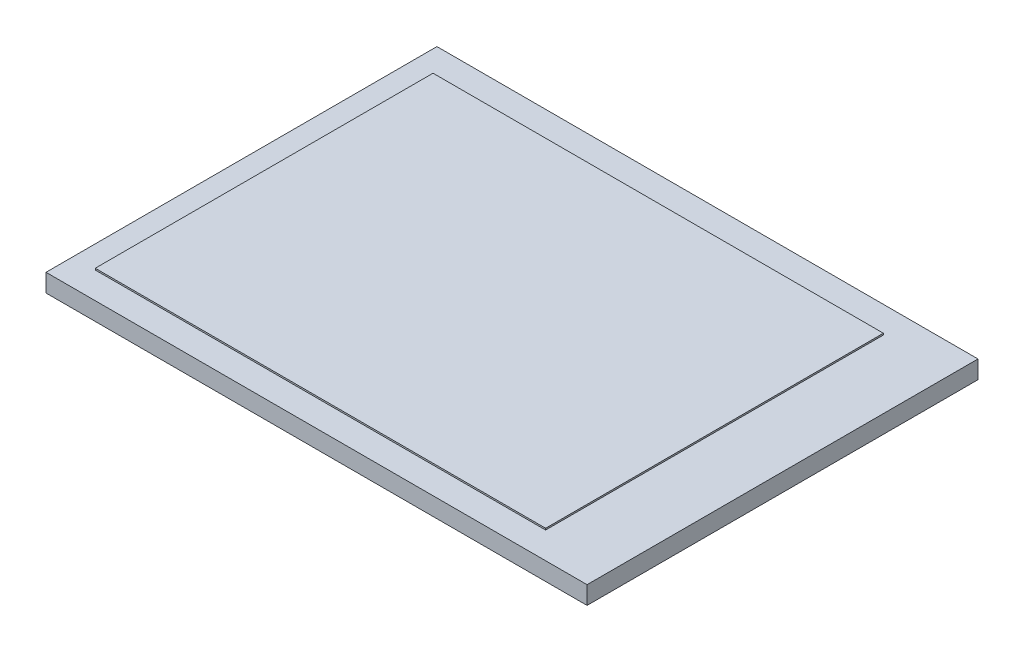
ISO-10303-21;
HEADER;
FILE_DESCRIPTION(('STEP AP214'),'2;1');
FILE_NAME('part.step','',(''),(''),'','','');
FILE_SCHEMA(('AUTOMOTIVE_DESIGN { 1 0 10303 214 1 1 1 1 }'));
ENDSEC;
DATA;
#1=APPLICATION_CONTEXT('core data for automotive mechanical design processes');
#2=APPLICATION_PROTOCOL_DEFINITION('international standard','automotive_design',2000,#1);
#3=PRODUCT_CONTEXT('',#1,'mechanical');
#4=PRODUCT('Part','Part','',(#3));
#5=PRODUCT_RELATED_PRODUCT_CATEGORY('part','',(#4));
#6=PRODUCT_DEFINITION_FORMATION('','',#4);
#7=PRODUCT_DEFINITION_CONTEXT('part definition',#1,'design');
#8=PRODUCT_DEFINITION('design','',#6,#7);
#9=PRODUCT_DEFINITION_SHAPE('','',#8);
#10=(LENGTH_UNIT() NAMED_UNIT(*) SI_UNIT(.MILLI.,.METRE.));
#11=(NAMED_UNIT(*) PLANE_ANGLE_UNIT() SI_UNIT($,.RADIAN.));
#12=(NAMED_UNIT(*) SI_UNIT($,.STERADIAN.) SOLID_ANGLE_UNIT());
#13=UNCERTAINTY_MEASURE_WITH_UNIT(LENGTH_MEASURE(1.E-05),#10,'distance_accuracy_value','');
#14=(GEOMETRIC_REPRESENTATION_CONTEXT(3) GLOBAL_UNCERTAINTY_ASSIGNED_CONTEXT((#13)) GLOBAL_UNIT_ASSIGNED_CONTEXT((#10,
#11,#12)) REPRESENTATION_CONTEXT('',''));
#15=CARTESIAN_POINT('',(0.,0.,0.));
#16=DIRECTION('',(0.,0.,1.));
#17=DIRECTION('',(1.,0.,0.));
#18=AXIS2_PLACEMENT_3D('',#15,#16,#17);
#19=CARTESIAN_POINT('',(0.,2.3,0.));
#20=DIRECTION('',(0.,-1.,0.));
#21=DIRECTION('',(0.,0.,-1.));
#22=AXIS2_PLACEMENT_3D('',#19,#20,#21);
#23=PLANE('',#22);
#24=DIRECTION('',(0.,0.,-1.));
#25=VECTOR('',#24,1.);
#26=CARTESIAN_POINT('',(34.6,2.3,25.));
#27=LINE('',#26,#25);
#28=CARTESIAN_POINT('',(34.6,2.3,25.));
#29=VERTEX_POINT('',#28);
#30=CARTESIAN_POINT('',(34.6,2.3,-25.));
#31=VERTEX_POINT('',#30);
#32=EDGE_CURVE('E128',#29,#31,#27,.T.);
#33=ORIENTED_EDGE('',*,*,#32,.T.);
#34=DIRECTION('',(-1.,0.,0.));
#35=VECTOR('',#34,1.);
#36=CARTESIAN_POINT('',(-34.6,2.3,-25.));
#37=LINE('',#36,#35);
#38=CARTESIAN_POINT('',(-34.6,2.3,-25.));
#39=VERTEX_POINT('',#38);
#40=EDGE_CURVE('E131',#31,#39,#37,.T.);
#41=ORIENTED_EDGE('',*,*,#40,.T.);
#42=DIRECTION('',(0.,0.,1.));
#43=VECTOR('',#42,1.);
#44=CARTESIAN_POINT('',(-34.6,2.3,25.));
#45=LINE('',#44,#43);
#46=CARTESIAN_POINT('',(-34.6,2.3,25.));
#47=VERTEX_POINT('',#46);
#48=EDGE_CURVE('E134',#39,#47,#45,.T.);
#49=ORIENTED_EDGE('',*,*,#48,.T.);
#50=DIRECTION('',(1.,0.,0.));
#51=VECTOR('',#50,1.);
#52=CARTESIAN_POINT('',(-34.6,2.3,25.));
#53=LINE('',#52,#51);
#54=EDGE_CURVE('E136',#47,#29,#53,.T.);
#55=ORIENTED_EDGE('',*,*,#54,.T.);
#56=EDGE_LOOP('',(#33,#41,#49,#55));
#57=FACE_BOUND('',#56,.T.);
#58=DIRECTION('',(0.,0.,1.));
#59=VECTOR('',#58,1.);
#60=CARTESIAN_POINT('',(-31.7,2.3,21.6));
#61=LINE('',#60,#59);
#62=CARTESIAN_POINT('',(-31.7,2.3,-21.6));
#63=VERTEX_POINT('',#62);
#64=CARTESIAN_POINT('',(-31.7,2.3,21.6));
#65=VERTEX_POINT('',#64);
#66=EDGE_CURVE('E49',#63,#65,#61,.T.);
#67=ORIENTED_EDGE('',*,*,#66,.F.);
#68=DIRECTION('',(-1.,0.,0.));
#69=VECTOR('',#68,1.);
#70=CARTESIAN_POINT('',(25.9,2.3,-21.6));
#71=LINE('',#70,#69);
#72=CARTESIAN_POINT('',(25.9,2.3,-21.6));
#73=VERTEX_POINT('',#72);
#74=EDGE_CURVE('E53',#73,#63,#71,.T.);
#75=ORIENTED_EDGE('',*,*,#74,.F.);
#76=DIRECTION('',(0.,0.,-1.));
#77=VECTOR('',#76,1.);
#78=CARTESIAN_POINT('',(25.9,2.3,21.6));
#79=LINE('',#78,#77);
#80=CARTESIAN_POINT('',(25.9,2.3,21.6));
#81=VERTEX_POINT('',#80);
#82=EDGE_CURVE('E243',#81,#73,#79,.T.);
#83=ORIENTED_EDGE('',*,*,#82,.F.);
#84=DIRECTION('',(1.,0.,0.));
#85=VECTOR('',#84,1.);
#86=CARTESIAN_POINT('',(25.9,2.3,21.6));
#87=LINE('',#86,#85);
#88=EDGE_CURVE('E249',#65,#81,#87,.T.);
#89=ORIENTED_EDGE('',*,*,#88,.F.);
#90=EDGE_LOOP('',(#67,#75,#83,#89));
#91=FACE_BOUND('',#90,.T.);
#92=ADVANCED_FACE('F34',(#57,#91),#23,.F.);
#93=CARTESIAN_POINT('',(34.6,2.3,25.));
#94=DIRECTION('',(-1.,0.,0.));
#95=DIRECTION('',(0.,0.,1.));
#96=AXIS2_PLACEMENT_3D('',#93,#94,#95);
#97=PLANE('',#96);
#98=DIRECTION('',(0.,0.,-1.));
#99=VECTOR('',#98,1.);
#100=CARTESIAN_POINT('',(34.6,0.,25.));
#101=LINE('',#100,#99);
#102=CARTESIAN_POINT('',(34.6,0.,25.));
#103=VERTEX_POINT('',#102);
#104=CARTESIAN_POINT('',(34.6,0.,-25.));
#105=VERTEX_POINT('',#104);
#106=EDGE_CURVE('E119',#103,#105,#101,.T.);
#107=ORIENTED_EDGE('',*,*,#106,.T.);
#108=DIRECTION('',(0.,-1.,0.));
#109=VECTOR('',#108,1.);
#110=CARTESIAN_POINT('',(34.6,2.3,-25.));
#111=LINE('',#110,#109);
#112=EDGE_CURVE('E11',#31,#105,#111,.T.);
#113=ORIENTED_EDGE('',*,*,#112,.F.);
#114=ORIENTED_EDGE('',*,*,#32,.F.);
#115=DIRECTION('',(0.,-1.,0.));
#116=VECTOR('',#115,1.);
#117=CARTESIAN_POINT('',(34.6,2.3,25.));
#118=LINE('',#117,#116);
#119=EDGE_CURVE('E137',#29,#103,#118,.T.);
#120=ORIENTED_EDGE('',*,*,#119,.T.);
#121=EDGE_LOOP('',(#107,#113,#114,#120));
#122=FACE_BOUND('',#121,.T.);
#123=ADVANCED_FACE('F36',(#122),#97,.F.);
#124=CARTESIAN_POINT('',(-34.6,2.3,-25.));
#125=DIRECTION('',(0.,0.,1.));
#126=DIRECTION('',(1.,0.,0.));
#127=AXIS2_PLACEMENT_3D('',#124,#125,#126);
#128=PLANE('',#127);
#129=DIRECTION('',(-1.,0.,0.));
#130=VECTOR('',#129,1.);
#131=CARTESIAN_POINT('',(-34.6,0.,-25.));
#132=LINE('',#131,#130);
#133=CARTESIAN_POINT('',(-34.6,0.,-25.));
#134=VERTEX_POINT('',#133);
#135=EDGE_CURVE('E122',#105,#134,#132,.T.);
#136=ORIENTED_EDGE('',*,*,#135,.T.);
#137=DIRECTION('',(0.,-1.,0.));
#138=VECTOR('',#137,1.);
#139=CARTESIAN_POINT('',(-34.6,2.3,-25.));
#140=LINE('',#139,#138);
#141=EDGE_CURVE('E42',#39,#134,#140,.T.);
#142=ORIENTED_EDGE('',*,*,#141,.F.);
#143=ORIENTED_EDGE('',*,*,#40,.F.);
#144=ORIENTED_EDGE('',*,*,#112,.T.);
#145=EDGE_LOOP('',(#136,#142,#143,#144));
#146=FACE_BOUND('',#145,.T.);
#147=ADVANCED_FACE('F167',(#146),#128,.F.);
#148=CARTESIAN_POINT('',(-34.6,2.3,25.));
#149=DIRECTION('',(1.,0.,0.));
#150=DIRECTION('',(0.,0.,-1.));
#151=AXIS2_PLACEMENT_3D('',#148,#149,#150);
#152=PLANE('',#151);
#153=DIRECTION('',(0.,0.,1.));
#154=VECTOR('',#153,1.);
#155=CARTESIAN_POINT('',(-34.6,0.,25.));
#156=LINE('',#155,#154);
#157=CARTESIAN_POINT('',(-34.6,0.,25.));
#158=VERTEX_POINT('',#157);
#159=EDGE_CURVE('E140',#134,#158,#156,.T.);
#160=ORIENTED_EDGE('',*,*,#159,.T.);
#161=DIRECTION('',(0.,-1.,0.));
#162=VECTOR('',#161,1.);
#163=CARTESIAN_POINT('',(-34.6,2.3,25.));
#164=LINE('',#163,#162);
#165=EDGE_CURVE('E145',#47,#158,#164,.T.);
#166=ORIENTED_EDGE('',*,*,#165,.F.);
#167=ORIENTED_EDGE('',*,*,#48,.F.);
#168=ORIENTED_EDGE('',*,*,#141,.T.);
#169=EDGE_LOOP('',(#160,#166,#167,#168));
#170=FACE_BOUND('',#169,.T.);
#171=ADVANCED_FACE('F152',(#170),#152,.F.);
#172=CARTESIAN_POINT('',(-34.6,2.3,25.));
#173=DIRECTION('',(0.,0.,-1.));
#174=DIRECTION('',(-1.,0.,0.));
#175=AXIS2_PLACEMENT_3D('',#172,#173,#174);
#176=PLANE('',#175);
#177=DIRECTION('',(1.,0.,0.));
#178=VECTOR('',#177,1.);
#179=CARTESIAN_POINT('',(-34.6,0.,25.));
#180=LINE('',#179,#178);
#181=EDGE_CURVE('E132',#158,#103,#180,.T.);
#182=ORIENTED_EDGE('',*,*,#181,.T.);
#183=ORIENTED_EDGE('',*,*,#119,.F.);
#184=ORIENTED_EDGE('',*,*,#54,.F.);
#185=ORIENTED_EDGE('',*,*,#165,.T.);
#186=EDGE_LOOP('',(#182,#183,#184,#185));
#187=FACE_BOUND('',#186,.T.);
#188=ADVANCED_FACE('F161',(#187),#176,.F.);
#189=CARTESIAN_POINT('',(0.,0.,0.));
#190=DIRECTION('',(0.,-1.,0.));
#191=DIRECTION('',(0.,0.,-1.));
#192=AXIS2_PLACEMENT_3D('',#189,#190,#191);
#193=PLANE('',#192);
#194=ORIENTED_EDGE('',*,*,#106,.F.);
#195=ORIENTED_EDGE('',*,*,#181,.F.);
#196=ORIENTED_EDGE('',*,*,#159,.F.);
#197=ORIENTED_EDGE('',*,*,#135,.F.);
#198=EDGE_LOOP('',(#194,#195,#196,#197));
#199=FACE_BOUND('',#198,.T.);
#200=ADVANCED_FACE('F158',(#199),#193,.T.);
#201=CARTESIAN_POINT('',(-31.7,2.5,21.6));
#202=DIRECTION('',(1.,0.,0.));
#203=DIRECTION('',(0.,0.,-1.));
#204=AXIS2_PLACEMENT_3D('',#201,#202,#203);
#205=PLANE('',#204);
#206=ORIENTED_EDGE('',*,*,#66,.T.);
#207=DIRECTION('',(0.,-1.,0.));
#208=VECTOR('',#207,1.);
#209=CARTESIAN_POINT('',(-31.7,2.5,21.6));
#210=LINE('',#209,#208);
#211=CARTESIAN_POINT('',(-31.7,2.5,21.6));
#212=VERTEX_POINT('',#211);
#213=EDGE_CURVE('E102',#212,#65,#210,.T.);
#214=ORIENTED_EDGE('',*,*,#213,.F.);
#215=DIRECTION('',(0.,0.,1.));
#216=VECTOR('',#215,1.);
#217=CARTESIAN_POINT('',(-31.7,2.5,21.6));
#218=LINE('',#217,#216);
#219=CARTESIAN_POINT('',(-31.7,2.5,-21.6));
#220=VERTEX_POINT('',#219);
#221=EDGE_CURVE('E108',#220,#212,#218,.T.);
#222=ORIENTED_EDGE('',*,*,#221,.F.);
#223=DIRECTION('',(0.,-1.,0.));
#224=VECTOR('',#223,1.);
#225=CARTESIAN_POINT('',(-31.7,2.5,-21.6));
#226=LINE('',#225,#224);
#227=EDGE_CURVE('E241',#220,#63,#226,.T.);
#228=ORIENTED_EDGE('',*,*,#227,.T.);
#229=EDGE_LOOP('',(#206,#214,#222,#228));
#230=FACE_BOUND('',#229,.T.);
#231=ADVANCED_FACE('F118',(#230),#205,.F.);
#232=CARTESIAN_POINT('',(25.9,2.5,21.6));
#233=DIRECTION('',(0.,0.,-1.));
#234=DIRECTION('',(-1.,0.,0.));
#235=AXIS2_PLACEMENT_3D('',#232,#233,#234);
#236=PLANE('',#235);
#237=ORIENTED_EDGE('',*,*,#88,.T.);
#238=DIRECTION('',(0.,-1.,0.));
#239=VECTOR('',#238,1.);
#240=CARTESIAN_POINT('',(25.9,2.5,21.6));
#241=LINE('',#240,#239);
#242=CARTESIAN_POINT('',(25.9,2.5,21.6));
#243=VERTEX_POINT('',#242);
#244=EDGE_CURVE('E104',#243,#81,#241,.T.);
#245=ORIENTED_EDGE('',*,*,#244,.F.);
#246=DIRECTION('',(1.,0.,0.));
#247=VECTOR('',#246,1.);
#248=CARTESIAN_POINT('',(25.9,2.5,21.6));
#249=LINE('',#248,#247);
#250=EDGE_CURVE('E97',#212,#243,#249,.T.);
#251=ORIENTED_EDGE('',*,*,#250,.F.);
#252=ORIENTED_EDGE('',*,*,#213,.T.);
#253=EDGE_LOOP('',(#237,#245,#251,#252));
#254=FACE_BOUND('',#253,.T.);
#255=ADVANCED_FACE('F100',(#254),#236,.F.);
#256=CARTESIAN_POINT('',(25.9,2.5,21.6));
#257=DIRECTION('',(-1.,0.,0.));
#258=DIRECTION('',(0.,0.,1.));
#259=AXIS2_PLACEMENT_3D('',#256,#257,#258);
#260=PLANE('',#259);
#261=ORIENTED_EDGE('',*,*,#82,.T.);
#262=DIRECTION('',(0.,-1.,0.));
#263=VECTOR('',#262,1.);
#264=CARTESIAN_POINT('',(25.9,2.5,-21.6));
#265=LINE('',#264,#263);
#266=CARTESIAN_POINT('',(25.9,2.5,-21.6));
#267=VERTEX_POINT('',#266);
#268=EDGE_CURVE('E124',#267,#73,#265,.T.);
#269=ORIENTED_EDGE('',*,*,#268,.F.);
#270=DIRECTION('',(0.,0.,-1.));
#271=VECTOR('',#270,1.);
#272=CARTESIAN_POINT('',(25.9,2.5,21.6));
#273=LINE('',#272,#271);
#274=EDGE_CURVE('E107',#243,#267,#273,.T.);
#275=ORIENTED_EDGE('',*,*,#274,.F.);
#276=ORIENTED_EDGE('',*,*,#244,.T.);
#277=EDGE_LOOP('',(#261,#269,#275,#276));
#278=FACE_BOUND('',#277,.T.);
#279=ADVANCED_FACE('F207',(#278),#260,.F.);
#280=CARTESIAN_POINT('',(25.9,2.5,-21.6));
#281=DIRECTION('',(0.,0.,1.));
#282=DIRECTION('',(1.,0.,0.));
#283=AXIS2_PLACEMENT_3D('',#280,#281,#282);
#284=PLANE('',#283);
#285=ORIENTED_EDGE('',*,*,#74,.T.);
#286=ORIENTED_EDGE('',*,*,#227,.F.);
#287=DIRECTION('',(-1.,0.,0.));
#288=VECTOR('',#287,1.);
#289=CARTESIAN_POINT('',(25.9,2.5,-21.6));
#290=LINE('',#289,#288);
#291=EDGE_CURVE('E113',#267,#220,#290,.T.);
#292=ORIENTED_EDGE('',*,*,#291,.F.);
#293=ORIENTED_EDGE('',*,*,#268,.T.);
#294=EDGE_LOOP('',(#285,#286,#292,#293));
#295=FACE_BOUND('',#294,.T.);
#296=ADVANCED_FACE('F213',(#295),#284,.F.);
#297=CARTESIAN_POINT('',(0.,2.5,0.));
#298=DIRECTION('',(0.,1.,0.));
#299=DIRECTION('',(0.,0.,1.));
#300=AXIS2_PLACEMENT_3D('',#297,#298,#299);
#301=PLANE('',#300);
#302=ORIENTED_EDGE('',*,*,#221,.T.);
#303=ORIENTED_EDGE('',*,*,#250,.T.);
#304=ORIENTED_EDGE('',*,*,#274,.T.);
#305=ORIENTED_EDGE('',*,*,#291,.T.);
#306=EDGE_LOOP('',(#302,#303,#304,#305));
#307=FACE_BOUND('',#306,.T.);
#308=ADVANCED_FACE('F111',(#307),#301,.T.);
#309=CLOSED_SHELL('',(#92,#123,#147,#171,#188,#200,#231,#255,#279,#296,#308));
#310=MANIFOLD_SOLID_BREP('B2',#309);
#311=ADVANCED_BREP_SHAPE_REPRESENTATION('',(#18,#310),#14);
#312=SHAPE_DEFINITION_REPRESENTATION(#9,#311);
ENDSEC;
END-ISO-10303-21;
